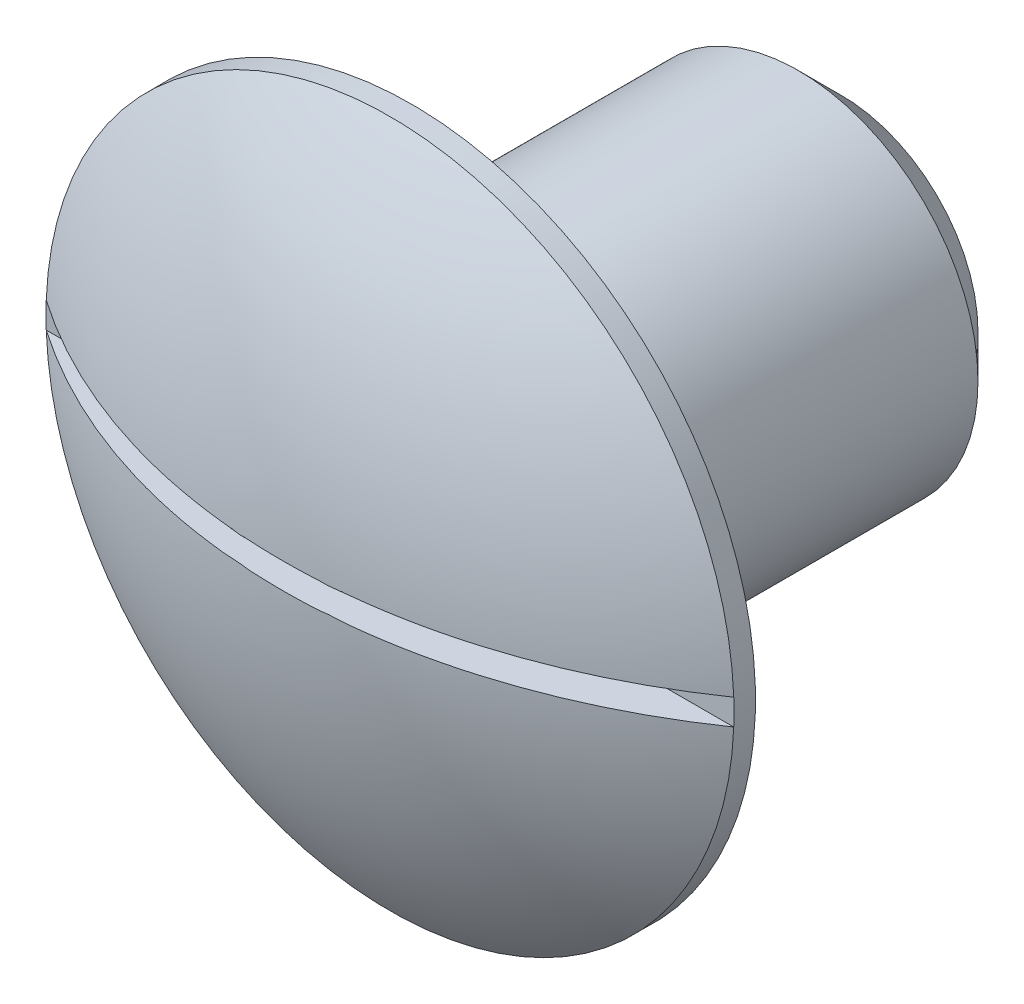
ISO-10303-21;
HEADER;
FILE_DESCRIPTION(('STEP AP214'),'2;1');
FILE_NAME('part.step','',(''),(''),'','','');
FILE_SCHEMA(('AUTOMOTIVE_DESIGN { 1 0 10303 214 1 1 1 1 }'));
ENDSEC;
DATA;
#1=APPLICATION_CONTEXT('core data for automotive mechanical design processes');
#2=APPLICATION_PROTOCOL_DEFINITION('international standard','automotive_design',2000,#1);
#3=PRODUCT_CONTEXT('',#1,'mechanical');
#4=PRODUCT('Part','Part','',(#3));
#5=PRODUCT_RELATED_PRODUCT_CATEGORY('part','',(#4));
#6=PRODUCT_DEFINITION_FORMATION('','',#4);
#7=PRODUCT_DEFINITION_CONTEXT('part definition',#1,'design');
#8=PRODUCT_DEFINITION('design','',#6,#7);
#9=PRODUCT_DEFINITION_SHAPE('','',#8);
#10=(LENGTH_UNIT() NAMED_UNIT(*) SI_UNIT(.MILLI.,.METRE.));
#11=(NAMED_UNIT(*) PLANE_ANGLE_UNIT() SI_UNIT($,.RADIAN.));
#12=(NAMED_UNIT(*) SI_UNIT($,.STERADIAN.) SOLID_ANGLE_UNIT());
#13=UNCERTAINTY_MEASURE_WITH_UNIT(LENGTH_MEASURE(1.E-05),#10,'distance_accuracy_value','');
#14=(GEOMETRIC_REPRESENTATION_CONTEXT(3) GLOBAL_UNCERTAINTY_ASSIGNED_CONTEXT((#13)) GLOBAL_UNIT_ASSIGNED_CONTEXT((#10,
#11,#12)) REPRESENTATION_CONTEXT('',''));
#15=CARTESIAN_POINT('',(0.,0.,0.));
#16=DIRECTION('',(0.,0.,1.));
#17=DIRECTION('',(1.,0.,0.));
#18=AXIS2_PLACEMENT_3D('',#15,#16,#17);
#19=CARTESIAN_POINT('',(0.,0.,-14.0335));
#20=DIRECTION('',(0.,0.,-1.));
#21=DIRECTION('',(-1.,0.,0.));
#22=AXIS2_PLACEMENT_3D('',#19,#20,#21);
#23=SPHERICAL_SURFACE('',#22,17.8435);
#24=CARTESIAN_POINT('',(0.,0.,0.635));
#25=DIRECTION('',(0.,0.,-1.));
#26=DIRECTION('',(-1.,0.,0.));
#27=AXIS2_PLACEMENT_3D('',#24,#25,#26);
#28=CIRCLE('',#27,10.16);
#29=CARTESIAN_POINT('',(10.152853736758,-0.381,0.635));
#30=VERTEX_POINT('',#29);
#31=CARTESIAN_POINT('',(-10.152853736758,-0.381,0.635000000000001));
#32=VERTEX_POINT('',#31);
#33=EDGE_CURVE('E74',#30,#32,#28,.T.);
#34=ORIENTED_EDGE('',*,*,#33,.F.);
#35=CARTESIAN_POINT('',(0.,-0.381,-14.0335));
#36=DIRECTION('',(0.,1.,0.));
#37=DIRECTION('',(0.,0.,1.));
#38=AXIS2_PLACEMENT_3D('',#35,#36,#37);
#39=CIRCLE('',#38,17.8394319206078);
#40=EDGE_CURVE('E80',#30,#32,#39,.F.);
#41=ORIENTED_EDGE('',*,*,#40,.T.);
#42=EDGE_LOOP('',(#34,#41));
#43=FACE_BOUND('',#42,.T.);
#44=ADVANCED_FACE('F38',(#43),#23,.T.);
#45=CARTESIAN_POINT('',(0.,0.,-12.7));
#46=DIRECTION('',(0.,0.,1.));
#47=DIRECTION('',(1.,0.,0.));
#48=AXIS2_PLACEMENT_3D('',#45,#46,#47);
#49=CYLINDRICAL_SURFACE('',#48,5.30225);
#50=CARTESIAN_POINT('',(0.,0.,-11.43));
#51=DIRECTION('',(0.,0.,1.));
#52=DIRECTION('',(1.,0.,0.));
#53=AXIS2_PLACEMENT_3D('',#50,#51,#52);
#54=CIRCLE('',#53,5.30225);
#55=CARTESIAN_POINT('',(5.30225,0.,-11.43));
#56=VERTEX_POINT('',#55);
#57=EDGE_CURVE('E46',#56,#56,#54,.T.);
#58=ORIENTED_EDGE('',*,*,#57,.T.);
#59=EDGE_LOOP('',(#58));
#60=FACE_BOUND('',#59,.T.);
#61=CARTESIAN_POINT('',(0.,0.,0.));
#62=DIRECTION('',(0.,0.,1.));
#63=DIRECTION('',(1.,0.,0.));
#64=AXIS2_PLACEMENT_3D('',#61,#62,#63);
#65=CIRCLE('',#64,5.30225);
#66=CARTESIAN_POINT('',(5.30225,0.,0.));
#67=VERTEX_POINT('',#66);
#68=EDGE_CURVE('E84',#67,#67,#65,.T.);
#69=ORIENTED_EDGE('',*,*,#68,.F.);
#70=EDGE_LOOP('',(#69));
#71=FACE_BOUND('',#70,.T.);
#72=ADVANCED_FACE('F100',(#60,#71),#49,.T.);
#73=CARTESIAN_POINT('',(0.,0.,-12.7));
#74=DIRECTION('',(0.,0.,1.));
#75=DIRECTION('',(1.,0.,0.));
#76=AXIS2_PLACEMENT_3D('',#73,#74,#75);
#77=PLANE('',#76);
#78=CARTESIAN_POINT('',(0.,0.,-12.7));
#79=DIRECTION('',(0.,0.,1.));
#80=DIRECTION('',(1.,0.,0.));
#81=AXIS2_PLACEMENT_3D('',#78,#79,#80);
#82=CIRCLE('',#81,4.03224999999999);
#83=CARTESIAN_POINT('',(4.03224999999999,0.,-12.7));
#84=VERTEX_POINT('',#83);
#85=EDGE_CURVE('E11',#84,#84,#82,.F.);
#86=ORIENTED_EDGE('',*,*,#85,.T.);
#87=EDGE_LOOP('',(#86));
#88=FACE_BOUND('',#87,.T.);
#89=ADVANCED_FACE('F117',(#88),#77,.F.);
#90=CARTESIAN_POINT('',(0.,0.,0.));
#91=DIRECTION('',(0.,0.,-1.));
#92=DIRECTION('',(-1.,0.,0.));
#93=AXIS2_PLACEMENT_3D('',#90,#91,#92);
#94=CYLINDRICAL_SURFACE('',#93,10.16);
#95=CARTESIAN_POINT('',(-10.152853736758,0.381,0.635));
#96=VERTEX_POINT('',#95);
#97=EDGE_CURVE('E53',#32,#96,#28,.T.);
#98=ORIENTED_EDGE('',*,*,#97,.T.);
#99=CARTESIAN_POINT('',(10.152853736758,0.381,0.635));
#100=VERTEX_POINT('',#99);
#101=EDGE_CURVE('E76',#96,#100,#28,.T.);
#102=ORIENTED_EDGE('',*,*,#101,.T.);
#103=EDGE_CURVE('E69',#100,#30,#28,.T.);
#104=ORIENTED_EDGE('',*,*,#103,.T.);
#105=ORIENTED_EDGE('',*,*,#33,.T.);
#106=EDGE_LOOP('',(#98,#102,#104,#105));
#107=FACE_BOUND('',#106,.T.);
#108=CARTESIAN_POINT('',(0.,0.,0.));
#109=DIRECTION('',(0.,0.,-1.));
#110=DIRECTION('',(-1.,0.,0.));
#111=AXIS2_PLACEMENT_3D('',#108,#109,#110);
#112=CIRCLE('',#111,10.16);
#113=CARTESIAN_POINT('',(-10.16,0.,0.));
#114=VERTEX_POINT('',#113);
#115=EDGE_CURVE('E89',#114,#114,#112,.T.);
#116=ORIENTED_EDGE('',*,*,#115,.F.);
#117=EDGE_LOOP('',(#116));
#118=FACE_BOUND('',#117,.T.);
#119=ADVANCED_FACE('F71',(#107,#118),#94,.T.);
#120=CARTESIAN_POINT('',(0.,0.381,-14.0335));
#121=DIRECTION('',(0.,1.,0.));
#122=DIRECTION('',(0.,0.,1.));
#123=AXIS2_PLACEMENT_3D('',#120,#121,#122);
#124=CIRCLE('',#123,17.8394319206078);
#125=EDGE_CURVE('E60',#100,#96,#124,.F.);
#126=ORIENTED_EDGE('',*,*,#125,.F.);
#127=ORIENTED_EDGE('',*,*,#101,.F.);
#128=EDGE_LOOP('',(#126,#127));
#129=FACE_BOUND('',#128,.T.);
#130=ADVANCED_FACE('F113',(#129),#23,.T.);
#131=CARTESIAN_POINT('',(0.,0.,0.));
#132=DIRECTION('',(0.,0.,1.));
#133=DIRECTION('',(1.,0.,0.));
#134=AXIS2_PLACEMENT_3D('',#131,#132,#133);
#135=PLANE('',#134);
#136=ORIENTED_EDGE('',*,*,#68,.T.);
#137=EDGE_LOOP('',(#136));
#138=FACE_BOUND('',#137,.T.);
#139=ORIENTED_EDGE('',*,*,#115,.T.);
#140=EDGE_LOOP('',(#139));
#141=FACE_BOUND('',#140,.T.);
#142=ADVANCED_FACE('F121',(#138,#141),#135,.F.);
#143=CARTESIAN_POINT('',(-10.16,0.381,0.635));
#144=DIRECTION('',(0.,0.,1.));
#145=DIRECTION('',(1.,0.,0.));
#146=AXIS2_PLACEMENT_3D('',#143,#144,#145);
#147=PLANE('',#146);
#148=DIRECTION('',(-1.,0.,0.));
#149=VECTOR('',#148,1.);
#150=CARTESIAN_POINT('',(-10.16,-0.381,0.635));
#151=LINE('',#150,#149);
#152=EDGE_CURVE('E82',#30,#32,#151,.T.);
#153=ORIENTED_EDGE('',*,*,#152,.F.);
#154=ORIENTED_EDGE('',*,*,#103,.F.);
#155=DIRECTION('',(-1.,0.,0.));
#156=VECTOR('',#155,1.);
#157=CARTESIAN_POINT('',(-10.16,0.381,0.635));
#158=LINE('',#157,#156);
#159=EDGE_CURVE('E87',#100,#96,#158,.T.);
#160=ORIENTED_EDGE('',*,*,#159,.T.);
#161=ORIENTED_EDGE('',*,*,#97,.F.);
#162=EDGE_LOOP('',(#153,#154,#160,#161));
#163=FACE_BOUND('',#162,.T.);
#164=ADVANCED_FACE('F86',(#163),#147,.T.);
#165=CARTESIAN_POINT('',(0.,0.381,0.));
#166=DIRECTION('',(0.,1.,0.));
#167=DIRECTION('',(0.,0.,1.));
#168=AXIS2_PLACEMENT_3D('',#165,#166,#167);
#169=PLANE('',#168);
#170=ORIENTED_EDGE('',*,*,#125,.T.);
#171=ORIENTED_EDGE('',*,*,#159,.F.);
#172=EDGE_LOOP('',(#170,#171));
#173=FACE_BOUND('',#172,.T.);
#174=ADVANCED_FACE('F108',(#173),#169,.F.);
#175=CARTESIAN_POINT('',(0.,-0.381,0.));
#176=DIRECTION('',(0.,1.,0.));
#177=DIRECTION('',(0.,0.,1.));
#178=AXIS2_PLACEMENT_3D('',#175,#176,#177);
#179=PLANE('',#178);
#180=ORIENTED_EDGE('',*,*,#152,.T.);
#181=ORIENTED_EDGE('',*,*,#40,.F.);
#182=EDGE_LOOP('',(#180,#181));
#183=FACE_BOUND('',#182,.T.);
#184=ADVANCED_FACE('F81',(#183),#179,.T.);
#185=CARTESIAN_POINT('',(0.,0.,-11.43));
#186=DIRECTION('',(0.,0.,1.));
#187=DIRECTION('',(1.,0.,0.));
#188=AXIS2_PLACEMENT_3D('',#185,#186,#187);
#189=CONICAL_SURFACE('',#188,5.30225,0.785398163397451);
#190=ORIENTED_EDGE('',*,*,#85,.F.);
#191=EDGE_LOOP('',(#190));
#192=FACE_BOUND('',#191,.T.);
#193=ORIENTED_EDGE('',*,*,#57,.F.);
#194=EDGE_LOOP('',(#193));
#195=FACE_BOUND('',#194,.T.);
#196=ADVANCED_FACE('F40',(#192,#195),#189,.T.);
#197=CLOSED_SHELL('',(#44,#72,#89,#119,#130,#142,#164,#174,#184,#196));
#198=MANIFOLD_SOLID_BREP('B2',#197);
#199=ADVANCED_BREP_SHAPE_REPRESENTATION('',(#18,#198),#14);
#200=SHAPE_DEFINITION_REPRESENTATION(#9,#199);
ENDSEC;
END-ISO-10303-21;
